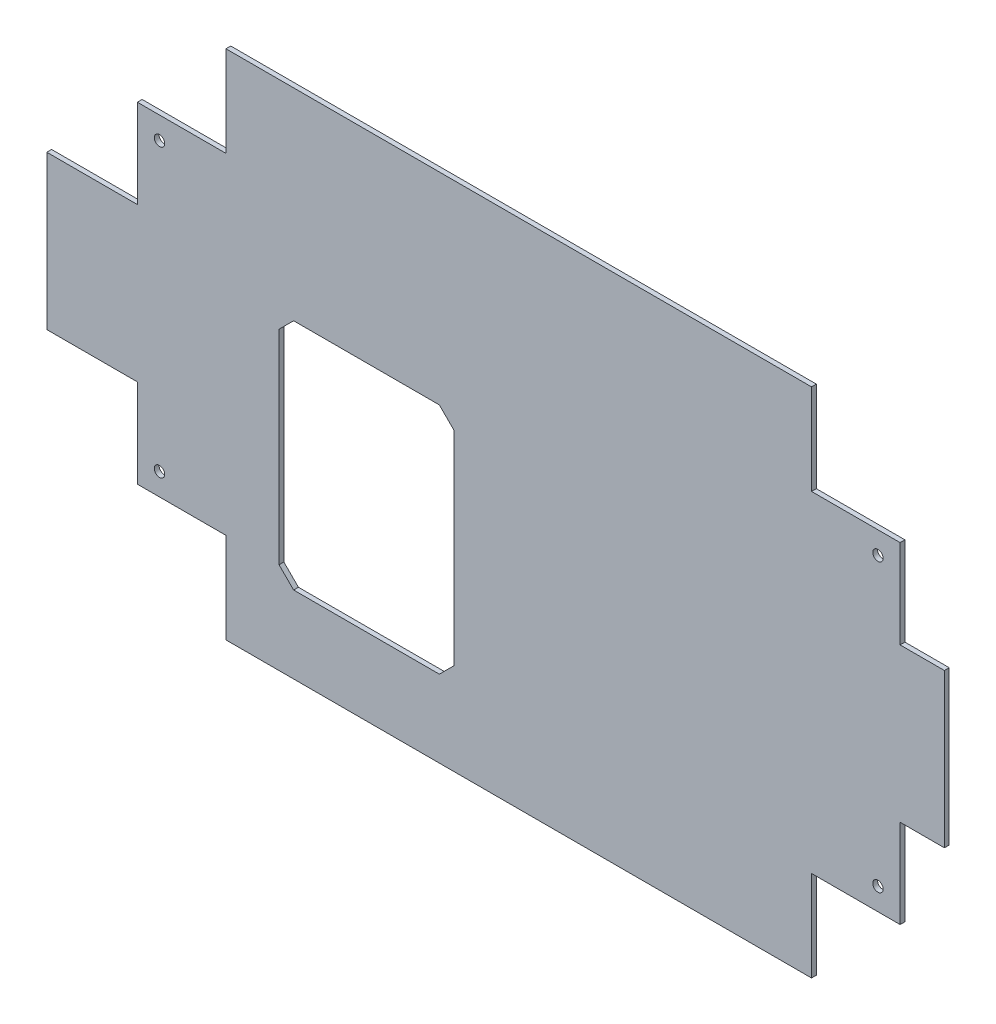
ISO-10303-21;
HEADER;
FILE_DESCRIPTION(('STEP AP214'),'2;1');
FILE_NAME('part.step','',(''),(''),'','','');
FILE_SCHEMA(('AUTOMOTIVE_DESIGN { 1 0 10303 214 1 1 1 1 }'));
ENDSEC;
DATA;
#1=APPLICATION_CONTEXT('core data for automotive mechanical design processes');
#2=APPLICATION_PROTOCOL_DEFINITION('international standard','automotive_design',2000,#1);
#3=PRODUCT_CONTEXT('',#1,'mechanical');
#4=PRODUCT('Part','Part','',(#3));
#5=PRODUCT_RELATED_PRODUCT_CATEGORY('part','',(#4));
#6=PRODUCT_DEFINITION_FORMATION('','',#4);
#7=PRODUCT_DEFINITION_CONTEXT('part definition',#1,'design');
#8=PRODUCT_DEFINITION('design','',#6,#7);
#9=PRODUCT_DEFINITION_SHAPE('','',#8);
#10=(LENGTH_UNIT() NAMED_UNIT(*) SI_UNIT(.MILLI.,.METRE.));
#11=(NAMED_UNIT(*) PLANE_ANGLE_UNIT() SI_UNIT($,.RADIAN.));
#12=(NAMED_UNIT(*) SI_UNIT($,.STERADIAN.) SOLID_ANGLE_UNIT());
#13=UNCERTAINTY_MEASURE_WITH_UNIT(LENGTH_MEASURE(1.E-05),#10,'distance_accuracy_value','');
#14=(GEOMETRIC_REPRESENTATION_CONTEXT(3) GLOBAL_UNCERTAINTY_ASSIGNED_CONTEXT((#13)) GLOBAL_UNIT_ASSIGNED_CONTEXT((#10,
#11,#12)) REPRESENTATION_CONTEXT('',''));
#15=CARTESIAN_POINT('',(0.,0.,0.));
#16=DIRECTION('',(0.,0.,1.));
#17=DIRECTION('',(1.,0.,0.));
#18=AXIS2_PLACEMENT_3D('',#15,#16,#17);
#19=CARTESIAN_POINT('',(-615.949999999996,52.7000000000002,3.3));
#20=DIRECTION('',(0.,-1.,0.));
#21=DIRECTION('',(1.,0.,0.));
#22=AXIS2_PLACEMENT_3D('',#19,#20,#21);
#23=PLANE('',#22);
#24=DIRECTION('',(-1.,0.,0.));
#25=VECTOR('',#24,1.);
#26=CARTESIAN_POINT('',(-615.949999999996,52.7000000000002,0.));
#27=LINE('',#26,#25);
#28=CARTESIAN_POINT('',(-553.799999999996,52.7000000000001,0.));
#29=VERTEX_POINT('',#28);
#30=CARTESIAN_POINT('',(-615.949999999996,52.7000000000002,0.));
#31=VERTEX_POINT('',#30);
#32=EDGE_CURVE('E289',#29,#31,#27,.T.);
#33=ORIENTED_EDGE('',*,*,#32,.T.);
#34=DIRECTION('',(0.,0.,-1.));
#35=VECTOR('',#34,1.);
#36=CARTESIAN_POINT('',(-615.949999999996,52.7000000000002,3.3));
#37=LINE('',#36,#35);
#38=CARTESIAN_POINT('',(-615.949999999996,52.7000000000002,3.3));
#39=VERTEX_POINT('',#38);
#40=EDGE_CURVE('E405',#39,#31,#37,.T.);
#41=ORIENTED_EDGE('',*,*,#40,.F.);
#42=DIRECTION('',(-1.,0.,0.));
#43=VECTOR('',#42,1.);
#44=CARTESIAN_POINT('',(-615.949999999996,52.7000000000002,3.3));
#45=LINE('',#44,#43);
#46=CARTESIAN_POINT('',(-553.799999999996,52.7000000000001,3.3));
#47=VERTEX_POINT('',#46);
#48=EDGE_CURVE('E291',#47,#39,#45,.T.);
#49=ORIENTED_EDGE('',*,*,#48,.F.);
#50=DIRECTION('',(0.,0.,-1.));
#51=VECTOR('',#50,1.);
#52=CARTESIAN_POINT('',(-553.799999999996,52.7000000000001,3.3));
#53=LINE('',#52,#51);
#54=EDGE_CURVE('E330',#47,#29,#53,.T.);
#55=ORIENTED_EDGE('',*,*,#54,.T.);
#56=EDGE_LOOP('',(#33,#41,#49,#55));
#57=FACE_BOUND('',#56,.T.);
#58=ADVANCED_FACE('F34',(#57),#23,.F.);
#59=CARTESIAN_POINT('',(-615.949999999996,52.7000000000002,3.3));
#60=DIRECTION('',(1.,0.,0.));
#61=DIRECTION('',(0.,0.,-1.));
#62=AXIS2_PLACEMENT_3D('',#59,#60,#61);
#63=PLANE('',#62);
#64=DIRECTION('',(0.,-1.,0.));
#65=VECTOR('',#64,1.);
#66=CARTESIAN_POINT('',(-615.949999999996,52.7000000000002,0.));
#67=LINE('',#66,#65);
#68=CARTESIAN_POINT('',(-615.949999999996,-52.7,0.));
#69=VERTEX_POINT('',#68);
#70=EDGE_CURVE('E333',#31,#69,#67,.T.);
#71=ORIENTED_EDGE('',*,*,#70,.T.);
#72=DIRECTION('',(0.,0.,-1.));
#73=VECTOR('',#72,1.);
#74=CARTESIAN_POINT('',(-615.949999999996,-52.7,3.3));
#75=LINE('',#74,#73);
#76=CARTESIAN_POINT('',(-615.949999999996,-52.7,3.3));
#77=VERTEX_POINT('',#76);
#78=EDGE_CURVE('E402',#77,#69,#75,.T.);
#79=ORIENTED_EDGE('',*,*,#78,.F.);
#80=DIRECTION('',(0.,-1.,0.));
#81=VECTOR('',#80,1.);
#82=CARTESIAN_POINT('',(-615.949999999996,52.7000000000002,3.3));
#83=LINE('',#82,#81);
#84=EDGE_CURVE('E294',#39,#77,#83,.T.);
#85=ORIENTED_EDGE('',*,*,#84,.F.);
#86=ORIENTED_EDGE('',*,*,#40,.T.);
#87=EDGE_LOOP('',(#71,#79,#85,#86));
#88=FACE_BOUND('',#87,.T.);
#89=ADVANCED_FACE('F489',(#88),#63,.F.);
#90=CARTESIAN_POINT('',(-615.949999999996,-52.7,3.3));
#91=DIRECTION('',(0.,1.,0.));
#92=DIRECTION('',(0.,0.,1.));
#93=AXIS2_PLACEMENT_3D('',#90,#91,#92);
#94=PLANE('',#93);
#95=DIRECTION('',(1.,0.,0.));
#96=VECTOR('',#95,1.);
#97=CARTESIAN_POINT('',(-615.949999999996,-52.7,0.));
#98=LINE('',#97,#96);
#99=CARTESIAN_POINT('',(-553.799999999996,-52.7,0.));
#100=VERTEX_POINT('',#99);
#101=EDGE_CURVE('E335',#69,#100,#98,.T.);
#102=ORIENTED_EDGE('',*,*,#101,.T.);
#103=DIRECTION('',(0.,0.,-1.));
#104=VECTOR('',#103,1.);
#105=CARTESIAN_POINT('',(-553.799999999996,-52.7,3.30000000000008));
#106=LINE('',#105,#104);
#107=CARTESIAN_POINT('',(-553.799999999996,-52.7,3.30000000000008));
#108=VERTEX_POINT('',#107);
#109=EDGE_CURVE('E399',#108,#100,#106,.T.);
#110=ORIENTED_EDGE('',*,*,#109,.F.);
#111=DIRECTION('',(1.,0.,0.));
#112=VECTOR('',#111,1.);
#113=CARTESIAN_POINT('',(-615.949999999996,-52.7,3.3));
#114=LINE('',#113,#112);
#115=EDGE_CURVE('E297',#77,#108,#114,.T.);
#116=ORIENTED_EDGE('',*,*,#115,.F.);
#117=ORIENTED_EDGE('',*,*,#78,.T.);
#118=EDGE_LOOP('',(#102,#110,#116,#117));
#119=FACE_BOUND('',#118,.T.);
#120=ADVANCED_FACE('F495',(#119),#94,.F.);
#121=CARTESIAN_POINT('',(-553.799999999996,-52.7,3.30000000000008));
#122=DIRECTION('',(1.,0.,0.));
#123=DIRECTION('',(0.,0.,-1.));
#124=AXIS2_PLACEMENT_3D('',#121,#122,#123);
#125=PLANE('',#124);
#126=DIRECTION('',(0.,-1.,0.));
#127=VECTOR('',#126,1.);
#128=CARTESIAN_POINT('',(-553.799999999996,-52.7,0.));
#129=LINE('',#128,#127);
#130=CARTESIAN_POINT('',(-553.799999999997,-113.5,0.));
#131=VERTEX_POINT('',#130);
#132=EDGE_CURVE('E337',#100,#131,#129,.T.);
#133=ORIENTED_EDGE('',*,*,#132,.T.);
#134=DIRECTION('',(0.,0.,-1.));
#135=VECTOR('',#134,1.);
#136=CARTESIAN_POINT('',(-553.799999999997,-113.5,3.30000000000008));
#137=LINE('',#136,#135);
#138=CARTESIAN_POINT('',(-553.799999999997,-113.5,3.30000000000008));
#139=VERTEX_POINT('',#138);
#140=EDGE_CURVE('E396',#139,#131,#137,.T.);
#141=ORIENTED_EDGE('',*,*,#140,.F.);
#142=DIRECTION('',(0.,-1.,0.));
#143=VECTOR('',#142,1.);
#144=CARTESIAN_POINT('',(-553.799999999996,-52.7,3.30000000000008));
#145=LINE('',#144,#143);
#146=EDGE_CURVE('E299',#108,#139,#145,.T.);
#147=ORIENTED_EDGE('',*,*,#146,.F.);
#148=ORIENTED_EDGE('',*,*,#109,.T.);
#149=EDGE_LOOP('',(#133,#141,#147,#148));
#150=FACE_BOUND('',#149,.T.);
#151=ADVANCED_FACE('F599',(#150),#125,.F.);
#152=CARTESIAN_POINT('',(-553.799999999997,-113.5,3.30000000000008));
#153=DIRECTION('',(0.,1.,0.));
#154=DIRECTION('',(-1.,0.,0.));
#155=AXIS2_PLACEMENT_3D('',#152,#153,#154);
#156=PLANE('',#155);
#157=DIRECTION('',(1.,0.,0.));
#158=VECTOR('',#157,1.);
#159=CARTESIAN_POINT('',(-553.799999999997,-113.5,0.));
#160=LINE('',#159,#158);
#161=CARTESIAN_POINT('',(-492.999999999999,-113.5,0.));
#162=VERTEX_POINT('',#161);
#163=EDGE_CURVE('E233',#131,#162,#160,.T.);
#164=ORIENTED_EDGE('',*,*,#163,.T.);
#165=DIRECTION('',(0.,0.,-1.));
#166=VECTOR('',#165,1.);
#167=CARTESIAN_POINT('',(-492.999999999999,-113.5,3.30000000000008));
#168=LINE('',#167,#166);
#169=CARTESIAN_POINT('',(-492.999999999999,-113.5,3.30000000000008));
#170=VERTEX_POINT('',#169);
#171=EDGE_CURVE('E228',#170,#162,#168,.T.);
#172=ORIENTED_EDGE('',*,*,#171,.F.);
#173=DIRECTION('',(1.,0.,0.));
#174=VECTOR('',#173,1.);
#175=CARTESIAN_POINT('',(-553.799999999997,-113.5,3.30000000000008));
#176=LINE('',#175,#174);
#177=EDGE_CURVE('E301',#139,#170,#176,.T.);
#178=ORIENTED_EDGE('',*,*,#177,.F.);
#179=ORIENTED_EDGE('',*,*,#140,.T.);
#180=EDGE_LOOP('',(#164,#172,#178,#179));
#181=FACE_BOUND('',#180,.T.);
#182=ADVANCED_FACE('F596',(#181),#156,.F.);
#183=CARTESIAN_POINT('',(-492.999999999999,-113.5,3.30000000000008));
#184=DIRECTION('',(1.,0.,0.));
#185=DIRECTION('',(0.,1.,0.));
#186=AXIS2_PLACEMENT_3D('',#183,#184,#185);
#187=PLANE('',#186);
#188=DIRECTION('',(0.,-1.,0.));
#189=VECTOR('',#188,1.);
#190=CARTESIAN_POINT('',(-492.999999999999,-113.5,0.));
#191=LINE('',#190,#189);
#192=CARTESIAN_POINT('',(-492.999999999999,-175.65,0.));
#193=VERTEX_POINT('',#192);
#194=EDGE_CURVE('E221',#162,#193,#191,.T.);
#195=ORIENTED_EDGE('',*,*,#194,.T.);
#196=DIRECTION('',(0.,0.,1.));
#197=VECTOR('',#196,1.);
#198=CARTESIAN_POINT('',(-492.999999999999,-175.65,0.));
#199=LINE('',#198,#197);
#200=CARTESIAN_POINT('',(-492.999999999999,-175.65,3.3));
#201=VERTEX_POINT('',#200);
#202=EDGE_CURVE('E225',#193,#201,#199,.T.);
#203=ORIENTED_EDGE('',*,*,#202,.T.);
#204=DIRECTION('',(0.,-1.,0.));
#205=VECTOR('',#204,1.);
#206=CARTESIAN_POINT('',(-492.999999999999,-113.5,3.30000000000008));
#207=LINE('',#206,#205);
#208=EDGE_CURVE('E303',#170,#201,#207,.T.);
#209=ORIENTED_EDGE('',*,*,#208,.F.);
#210=ORIENTED_EDGE('',*,*,#171,.T.);
#211=EDGE_LOOP('',(#195,#203,#209,#210));
#212=FACE_BOUND('',#211,.T.);
#213=ADVANCED_FACE('F223',(#212),#187,.F.);
#214=CARTESIAN_POINT('',(-91.2000000000022,-174.3,3.3));
#215=DIRECTION('',(-1.,0.,0.));
#216=DIRECTION('',(0.,0.,1.));
#217=AXIS2_PLACEMENT_3D('',#214,#215,#216);
#218=PLANE('',#217);
#219=DIRECTION('',(0.,1.,0.));
#220=VECTOR('',#219,1.);
#221=CARTESIAN_POINT('',(-91.2000000000022,-174.3,0.));
#222=LINE('',#221,#220);
#223=CARTESIAN_POINT('',(-91.2000000000022,-175.65,0.));
#224=VERTEX_POINT('',#223);
#225=CARTESIAN_POINT('',(-91.2000000000022,-113.5,0.));
#226=VERTEX_POINT('',#225);
#227=EDGE_CURVE('E232',#224,#226,#222,.T.);
#228=ORIENTED_EDGE('',*,*,#227,.T.);
#229=DIRECTION('',(0.,0.,-1.));
#230=VECTOR('',#229,1.);
#231=CARTESIAN_POINT('',(-91.2000000000022,-113.5,3.30000000000008));
#232=LINE('',#231,#230);
#233=CARTESIAN_POINT('',(-91.2000000000022,-113.5,3.30000000000008));
#234=VERTEX_POINT('',#233);
#235=EDGE_CURVE('E392',#234,#226,#232,.T.);
#236=ORIENTED_EDGE('',*,*,#235,.F.);
#237=DIRECTION('',(0.,1.,0.));
#238=VECTOR('',#237,1.);
#239=CARTESIAN_POINT('',(-91.2000000000022,-174.3,3.3));
#240=LINE('',#239,#238);
#241=CARTESIAN_POINT('',(-91.2000000000022,-175.65,3.3));
#242=VERTEX_POINT('',#241);
#243=EDGE_CURVE('E305',#242,#234,#240,.T.);
#244=ORIENTED_EDGE('',*,*,#243,.F.);
#245=DIRECTION('',(0.,0.,1.));
#246=VECTOR('',#245,1.);
#247=CARTESIAN_POINT('',(-91.2000000000022,-175.65,0.));
#248=LINE('',#247,#246);
#249=EDGE_CURVE('E242',#224,#242,#248,.T.);
#250=ORIENTED_EDGE('',*,*,#249,.F.);
#251=EDGE_LOOP('',(#228,#236,#244,#250));
#252=FACE_BOUND('',#251,.T.);
#253=ADVANCED_FACE('F589',(#252),#218,.F.);
#254=CARTESIAN_POINT('',(-91.2000000000022,-113.5,3.30000000000008));
#255=DIRECTION('',(0.,1.,0.));
#256=DIRECTION('',(-1.,0.,0.));
#257=AXIS2_PLACEMENT_3D('',#254,#255,#256);
#258=PLANE('',#257);
#259=DIRECTION('',(1.,0.,0.));
#260=VECTOR('',#259,1.);
#261=CARTESIAN_POINT('',(-91.2000000000022,-113.5,0.));
#262=LINE('',#261,#260);
#263=CARTESIAN_POINT('',(-30.4000000000042,-113.5,0.));
#264=VERTEX_POINT('',#263);
#265=EDGE_CURVE('E341',#226,#264,#262,.T.);
#266=ORIENTED_EDGE('',*,*,#265,.T.);
#267=DIRECTION('',(0.,0.,-1.));
#268=VECTOR('',#267,1.);
#269=CARTESIAN_POINT('',(-30.4000000000042,-113.5,3.30000000000008));
#270=LINE('',#269,#268);
#271=CARTESIAN_POINT('',(-30.4000000000042,-113.5,3.30000000000008));
#272=VERTEX_POINT('',#271);
#273=EDGE_CURVE('E389',#272,#264,#270,.T.);
#274=ORIENTED_EDGE('',*,*,#273,.F.);
#275=DIRECTION('',(1.,0.,0.));
#276=VECTOR('',#275,1.);
#277=CARTESIAN_POINT('',(-91.2000000000022,-113.5,3.30000000000008));
#278=LINE('',#277,#276);
#279=EDGE_CURVE('E307',#234,#272,#278,.T.);
#280=ORIENTED_EDGE('',*,*,#279,.F.);
#281=ORIENTED_EDGE('',*,*,#235,.T.);
#282=EDGE_LOOP('',(#266,#274,#280,#281));
#283=FACE_BOUND('',#282,.T.);
#284=ADVANCED_FACE('F585',(#283),#258,.F.);
#285=CARTESIAN_POINT('',(-30.4000000000042,-113.5,3.30000000000008));
#286=DIRECTION('',(-1.,0.,0.));
#287=DIRECTION('',(0.,0.,1.));
#288=AXIS2_PLACEMENT_3D('',#285,#286,#287);
#289=PLANE('',#288);
#290=DIRECTION('',(0.,1.,0.));
#291=VECTOR('',#290,1.);
#292=CARTESIAN_POINT('',(-30.4000000000042,-113.5,0.));
#293=LINE('',#292,#291);
#294=CARTESIAN_POINT('',(-30.4000000000042,-52.6999999999999,0.));
#295=VERTEX_POINT('',#294);
#296=EDGE_CURVE('E343',#264,#295,#293,.T.);
#297=ORIENTED_EDGE('',*,*,#296,.T.);
#298=DIRECTION('',(0.,0.,-1.));
#299=VECTOR('',#298,1.);
#300=CARTESIAN_POINT('',(-30.4000000000042,-52.6999999999999,3.3));
#301=LINE('',#300,#299);
#302=CARTESIAN_POINT('',(-30.4000000000042,-52.6999999999999,3.3));
#303=VERTEX_POINT('',#302);
#304=EDGE_CURVE('E386',#303,#295,#301,.T.);
#305=ORIENTED_EDGE('',*,*,#304,.F.);
#306=DIRECTION('',(0.,1.,0.));
#307=VECTOR('',#306,1.);
#308=CARTESIAN_POINT('',(-30.4000000000042,-113.5,3.30000000000008));
#309=LINE('',#308,#307);
#310=EDGE_CURVE('E309',#272,#303,#309,.T.);
#311=ORIENTED_EDGE('',*,*,#310,.F.);
#312=ORIENTED_EDGE('',*,*,#273,.T.);
#313=EDGE_LOOP('',(#297,#305,#311,#312));
#314=FACE_BOUND('',#313,.T.);
#315=ADVANCED_FACE('F581',(#314),#289,.F.);
#316=CARTESIAN_POINT('',(-30.4000000000042,-52.6999999999999,3.3));
#317=DIRECTION('',(0.,1.,0.));
#318=DIRECTION('',(-1.,0.,0.));
#319=AXIS2_PLACEMENT_3D('',#316,#317,#318);
#320=PLANE('',#319);
#321=DIRECTION('',(1.,0.,0.));
#322=VECTOR('',#321,1.);
#323=CARTESIAN_POINT('',(-30.4000000000042,-52.6999999999999,0.));
#324=LINE('',#323,#322);
#325=CARTESIAN_POINT('',(0.,-52.7,0.));
#326=VERTEX_POINT('',#325);
#327=EDGE_CURVE('E345',#295,#326,#324,.T.);
#328=ORIENTED_EDGE('',*,*,#327,.T.);
#329=DIRECTION('',(0.,0.,-1.));
#330=VECTOR('',#329,1.);
#331=CARTESIAN_POINT('',(0.,-52.7,3.3));
#332=LINE('',#331,#330);
#333=CARTESIAN_POINT('',(0.,-52.7,3.3));
#334=VERTEX_POINT('',#333);
#335=EDGE_CURVE('E383',#334,#326,#332,.T.);
#336=ORIENTED_EDGE('',*,*,#335,.F.);
#337=DIRECTION('',(1.,0.,0.));
#338=VECTOR('',#337,1.);
#339=CARTESIAN_POINT('',(-30.4000000000042,-52.6999999999999,3.3));
#340=LINE('',#339,#338);
#341=EDGE_CURVE('E311',#303,#334,#340,.T.);
#342=ORIENTED_EDGE('',*,*,#341,.F.);
#343=ORIENTED_EDGE('',*,*,#304,.T.);
#344=EDGE_LOOP('',(#328,#336,#342,#343));
#345=FACE_BOUND('',#344,.T.);
#346=ADVANCED_FACE('F577',(#345),#320,.F.);
#347=CARTESIAN_POINT('',(0.,-52.7,3.3));
#348=DIRECTION('',(-1.,0.,0.));
#349=DIRECTION('',(0.,-1.,0.));
#350=AXIS2_PLACEMENT_3D('',#347,#348,#349);
#351=PLANE('',#350);
#352=DIRECTION('',(0.,1.,0.));
#353=VECTOR('',#352,1.);
#354=CARTESIAN_POINT('',(0.,-52.7,0.));
#355=LINE('',#354,#353);
#356=CARTESIAN_POINT('',(0.,52.7,0.));
#357=VERTEX_POINT('',#356);
#358=EDGE_CURVE('E347',#326,#357,#355,.T.);
#359=ORIENTED_EDGE('',*,*,#358,.T.);
#360=DIRECTION('',(0.,0.,-1.));
#361=VECTOR('',#360,1.);
#362=CARTESIAN_POINT('',(0.,52.7,3.3));
#363=LINE('',#362,#361);
#364=CARTESIAN_POINT('',(0.,52.7,3.3));
#365=VERTEX_POINT('',#364);
#366=EDGE_CURVE('E380',#365,#357,#363,.T.);
#367=ORIENTED_EDGE('',*,*,#366,.F.);
#368=DIRECTION('',(0.,1.,0.));
#369=VECTOR('',#368,1.);
#370=CARTESIAN_POINT('',(0.,-52.7,3.3));
#371=LINE('',#370,#369);
#372=EDGE_CURVE('E313',#334,#365,#371,.T.);
#373=ORIENTED_EDGE('',*,*,#372,.F.);
#374=ORIENTED_EDGE('',*,*,#335,.T.);
#375=EDGE_LOOP('',(#359,#367,#373,#374));
#376=FACE_BOUND('',#375,.T.);
#377=ADVANCED_FACE('F573',(#376),#351,.F.);
#378=CARTESIAN_POINT('',(0.,52.7,3.3));
#379=DIRECTION('',(0.,-1.,0.));
#380=DIRECTION('',(0.,0.,-1.));
#381=AXIS2_PLACEMENT_3D('',#378,#379,#380);
#382=PLANE('',#381);
#383=DIRECTION('',(-1.,0.,0.));
#384=VECTOR('',#383,1.);
#385=CARTESIAN_POINT('',(0.,52.7,0.));
#386=LINE('',#385,#384);
#387=CARTESIAN_POINT('',(-30.4000000000042,52.7,0.));
#388=VERTEX_POINT('',#387);
#389=EDGE_CURVE('E349',#357,#388,#386,.T.);
#390=ORIENTED_EDGE('',*,*,#389,.T.);
#391=DIRECTION('',(0.,0.,-1.));
#392=VECTOR('',#391,1.);
#393=CARTESIAN_POINT('',(-30.4000000000042,52.7,3.3));
#394=LINE('',#393,#392);
#395=CARTESIAN_POINT('',(-30.4000000000042,52.7,3.3));
#396=VERTEX_POINT('',#395);
#397=EDGE_CURVE('E377',#396,#388,#394,.T.);
#398=ORIENTED_EDGE('',*,*,#397,.F.);
#399=DIRECTION('',(-1.,0.,0.));
#400=VECTOR('',#399,1.);
#401=CARTESIAN_POINT('',(0.,52.7,3.3));
#402=LINE('',#401,#400);
#403=EDGE_CURVE('E315',#365,#396,#402,.T.);
#404=ORIENTED_EDGE('',*,*,#403,.F.);
#405=ORIENTED_EDGE('',*,*,#366,.T.);
#406=EDGE_LOOP('',(#390,#398,#404,#405));
#407=FACE_BOUND('',#406,.T.);
#408=ADVANCED_FACE('F569',(#407),#382,.F.);
#409=CARTESIAN_POINT('',(-30.4000000000042,52.7,3.3));
#410=DIRECTION('',(-1.,0.,0.));
#411=DIRECTION('',(0.,-1.,0.));
#412=AXIS2_PLACEMENT_3D('',#409,#410,#411);
#413=PLANE('',#412);
#414=DIRECTION('',(0.,1.,0.));
#415=VECTOR('',#414,1.);
#416=CARTESIAN_POINT('',(-30.4000000000042,52.7,0.));
#417=LINE('',#416,#415);
#418=CARTESIAN_POINT('',(-30.4000000000042,113.5,0.));
#419=VERTEX_POINT('',#418);
#420=EDGE_CURVE('E351',#388,#419,#417,.T.);
#421=ORIENTED_EDGE('',*,*,#420,.T.);
#422=DIRECTION('',(0.,0.,-1.));
#423=VECTOR('',#422,1.);
#424=CARTESIAN_POINT('',(-30.4000000000042,113.5,3.3));
#425=LINE('',#424,#423);
#426=CARTESIAN_POINT('',(-30.4000000000042,113.5,3.3));
#427=VERTEX_POINT('',#426);
#428=EDGE_CURVE('E374',#427,#419,#425,.T.);
#429=ORIENTED_EDGE('',*,*,#428,.F.);
#430=DIRECTION('',(0.,1.,0.));
#431=VECTOR('',#430,1.);
#432=CARTESIAN_POINT('',(-30.4000000000042,52.7,3.3));
#433=LINE('',#432,#431);
#434=EDGE_CURVE('E317',#396,#427,#433,.T.);
#435=ORIENTED_EDGE('',*,*,#434,.F.);
#436=ORIENTED_EDGE('',*,*,#397,.T.);
#437=EDGE_LOOP('',(#421,#429,#435,#436));
#438=FACE_BOUND('',#437,.T.);
#439=ADVANCED_FACE('F565',(#438),#413,.F.);
#440=CARTESIAN_POINT('',(-30.4000000000042,113.5,3.3));
#441=DIRECTION('',(0.,-1.,0.));
#442=DIRECTION('',(1.,0.,0.));
#443=AXIS2_PLACEMENT_3D('',#440,#441,#442);
#444=PLANE('',#443);
#445=DIRECTION('',(-1.,0.,0.));
#446=VECTOR('',#445,1.);
#447=CARTESIAN_POINT('',(-30.4000000000042,113.5,0.));
#448=LINE('',#447,#446);
#449=CARTESIAN_POINT('',(-91.2000000000022,113.5,0.));
#450=VERTEX_POINT('',#449);
#451=EDGE_CURVE('E353',#419,#450,#448,.T.);
#452=ORIENTED_EDGE('',*,*,#451,.T.);
#453=DIRECTION('',(0.,0.,-1.));
#454=VECTOR('',#453,1.);
#455=CARTESIAN_POINT('',(-91.2000000000022,113.5,3.3));
#456=LINE('',#455,#454);
#457=CARTESIAN_POINT('',(-91.2000000000022,113.5,3.3));
#458=VERTEX_POINT('',#457);
#459=EDGE_CURVE('E371',#458,#450,#456,.T.);
#460=ORIENTED_EDGE('',*,*,#459,.F.);
#461=DIRECTION('',(-1.,0.,0.));
#462=VECTOR('',#461,1.);
#463=CARTESIAN_POINT('',(-30.4000000000042,113.5,3.3));
#464=LINE('',#463,#462);
#465=EDGE_CURVE('E319',#427,#458,#464,.T.);
#466=ORIENTED_EDGE('',*,*,#465,.F.);
#467=ORIENTED_EDGE('',*,*,#428,.T.);
#468=EDGE_LOOP('',(#452,#460,#466,#467));
#469=FACE_BOUND('',#468,.T.);
#470=ADVANCED_FACE('F561',(#469),#444,.F.);
#471=CARTESIAN_POINT('',(-91.2000000000022,113.5,3.3));
#472=DIRECTION('',(-1.,0.,0.));
#473=DIRECTION('',(0.,-1.,0.));
#474=AXIS2_PLACEMENT_3D('',#471,#472,#473);
#475=PLANE('',#474);
#476=DIRECTION('',(0.,1.,0.));
#477=VECTOR('',#476,1.);
#478=CARTESIAN_POINT('',(-91.2000000000022,113.5,0.));
#479=LINE('',#478,#477);
#480=CARTESIAN_POINT('',(-91.2000000000023,175.65,0.));
#481=VERTEX_POINT('',#480);
#482=EDGE_CURVE('E355',#450,#481,#479,.T.);
#483=ORIENTED_EDGE('',*,*,#482,.T.);
#484=DIRECTION('',(0.,0.,1.));
#485=VECTOR('',#484,1.);
#486=CARTESIAN_POINT('',(-91.2000000000022,175.65,0.));
#487=LINE('',#486,#485);
#488=CARTESIAN_POINT('',(-91.2000000000022,175.65,3.30000000000008));
#489=VERTEX_POINT('',#488);
#490=EDGE_CURVE('E286',#481,#489,#487,.T.);
#491=ORIENTED_EDGE('',*,*,#490,.T.);
#492=DIRECTION('',(0.,1.,0.));
#493=VECTOR('',#492,1.);
#494=CARTESIAN_POINT('',(-91.2000000000022,113.5,3.3));
#495=LINE('',#494,#493);
#496=EDGE_CURVE('E321',#458,#489,#495,.T.);
#497=ORIENTED_EDGE('',*,*,#496,.F.);
#498=ORIENTED_EDGE('',*,*,#459,.T.);
#499=EDGE_LOOP('',(#483,#491,#497,#498));
#500=FACE_BOUND('',#499,.T.);
#501=ADVANCED_FACE('F557',(#500),#475,.F.);
#502=CARTESIAN_POINT('',(-492.999999999999,113.5,3.3));
#503=DIRECTION('',(1.,0.,0.));
#504=DIRECTION('',(0.,0.,-1.));
#505=AXIS2_PLACEMENT_3D('',#502,#503,#504);
#506=PLANE('',#505);
#507=DIRECTION('',(0.,-1.,0.));
#508=VECTOR('',#507,1.);
#509=CARTESIAN_POINT('',(-492.999999999999,113.5,3.3));
#510=LINE('',#509,#508);
#511=CARTESIAN_POINT('',(-492.999999999999,175.65,3.30000000000008));
#512=VERTEX_POINT('',#511);
#513=CARTESIAN_POINT('',(-492.999999999999,113.5,3.3));
#514=VERTEX_POINT('',#513);
#515=EDGE_CURVE('E324',#512,#514,#510,.T.);
#516=ORIENTED_EDGE('',*,*,#515,.F.);
#517=DIRECTION('',(0.,0.,1.));
#518=VECTOR('',#517,1.);
#519=CARTESIAN_POINT('',(-492.999999999999,175.65,0.));
#520=LINE('',#519,#518);
#521=CARTESIAN_POINT('',(-492.999999999999,175.65,0.));
#522=VERTEX_POINT('',#521);
#523=EDGE_CURVE('E284',#522,#512,#520,.T.);
#524=ORIENTED_EDGE('',*,*,#523,.F.);
#525=DIRECTION('',(0.,-1.,0.));
#526=VECTOR('',#525,1.);
#527=CARTESIAN_POINT('',(-492.999999999999,113.5,0.));
#528=LINE('',#527,#526);
#529=CARTESIAN_POINT('',(-492.999999999999,113.5,0.));
#530=VERTEX_POINT('',#529);
#531=EDGE_CURVE('E358',#522,#530,#528,.T.);
#532=ORIENTED_EDGE('',*,*,#531,.T.);
#533=DIRECTION('',(0.,0.,-1.));
#534=VECTOR('',#533,1.);
#535=CARTESIAN_POINT('',(-492.999999999999,113.5,3.3));
#536=LINE('',#535,#534);
#537=EDGE_CURVE('E368',#514,#530,#536,.T.);
#538=ORIENTED_EDGE('',*,*,#537,.F.);
#539=EDGE_LOOP('',(#516,#524,#532,#538));
#540=FACE_BOUND('',#539,.T.);
#541=ADVANCED_FACE('F553',(#540),#506,.F.);
#542=CARTESIAN_POINT('',(-553.799999999996,113.5,3.3));
#543=DIRECTION('',(0.,-1.,0.));
#544=DIRECTION('',(1.,0.,0.));
#545=AXIS2_PLACEMENT_3D('',#542,#543,#544);
#546=PLANE('',#545);
#547=DIRECTION('',(-1.,0.,0.));
#548=VECTOR('',#547,1.);
#549=CARTESIAN_POINT('',(-553.799999999996,113.5,0.));
#550=LINE('',#549,#548);
#551=CARTESIAN_POINT('',(-553.799999999996,113.5,0.));
#552=VERTEX_POINT('',#551);
#553=EDGE_CURVE('E360',#530,#552,#550,.T.);
#554=ORIENTED_EDGE('',*,*,#553,.T.);
#555=DIRECTION('',(0.,0.,-1.));
#556=VECTOR('',#555,1.);
#557=CARTESIAN_POINT('',(-553.799999999996,113.5,3.3));
#558=LINE('',#557,#556);
#559=CARTESIAN_POINT('',(-553.799999999996,113.5,3.3));
#560=VERTEX_POINT('',#559);
#561=EDGE_CURVE('E365',#560,#552,#558,.T.);
#562=ORIENTED_EDGE('',*,*,#561,.F.);
#563=DIRECTION('',(-1.,0.,0.));
#564=VECTOR('',#563,1.);
#565=CARTESIAN_POINT('',(-553.799999999996,113.5,3.3));
#566=LINE('',#565,#564);
#567=EDGE_CURVE('E326',#514,#560,#566,.T.);
#568=ORIENTED_EDGE('',*,*,#567,.F.);
#569=ORIENTED_EDGE('',*,*,#537,.T.);
#570=EDGE_LOOP('',(#554,#562,#568,#569));
#571=FACE_BOUND('',#570,.T.);
#572=ADVANCED_FACE('F549',(#571),#546,.F.);
#573=CARTESIAN_POINT('',(-553.799999999996,52.7000000000001,3.3));
#574=DIRECTION('',(1.,0.,0.));
#575=DIRECTION('',(0.,0.,-1.));
#576=AXIS2_PLACEMENT_3D('',#573,#574,#575);
#577=PLANE('',#576);
#578=DIRECTION('',(0.,-1.,0.));
#579=VECTOR('',#578,1.);
#580=CARTESIAN_POINT('',(-553.799999999996,52.7000000000001,0.));
#581=LINE('',#580,#579);
#582=EDGE_CURVE('E295',#552,#29,#581,.T.);
#583=ORIENTED_EDGE('',*,*,#582,.T.);
#584=ORIENTED_EDGE('',*,*,#54,.F.);
#585=DIRECTION('',(0.,-1.,0.));
#586=VECTOR('',#585,1.);
#587=CARTESIAN_POINT('',(-553.799999999996,52.7000000000001,3.3));
#588=LINE('',#587,#586);
#589=EDGE_CURVE('E328',#560,#47,#588,.T.);
#590=ORIENTED_EDGE('',*,*,#589,.F.);
#591=ORIENTED_EDGE('',*,*,#561,.T.);
#592=EDGE_LOOP('',(#583,#584,#590,#591));
#593=FACE_BOUND('',#592,.T.);
#594=ADVANCED_FACE('F544',(#593),#577,.F.);
#595=CARTESIAN_POINT('',(0.,0.,3.3));
#596=DIRECTION('',(0.,0.,1.));
#597=DIRECTION('',(1.,0.,0.));
#598=AXIS2_PLACEMENT_3D('',#595,#596,#597);
#599=PLANE('',#598);
#600=DIRECTION('',(1.,0.,0.));
#601=VECTOR('',#600,1.);
#602=CARTESIAN_POINT('',(-456.566519886666,37.2316052691823,3.3));
#603=LINE('',#602,#601);
#604=CARTESIAN_POINT('',(-446.566519886666,37.2316052691823,3.3));
#605=VERTEX_POINT('',#604);
#606=CARTESIAN_POINT('',(-346.566519886666,37.2316052691823,3.29999999999994));
#607=VERTEX_POINT('',#606);
#608=EDGE_CURVE('E249',#605,#607,#603,.T.);
#609=ORIENTED_EDGE('',*,*,#608,.T.);
#610=DIRECTION('',(-0.707106781186544,0.707106781186552,0.));
#611=VECTOR('',#610,1.);
#612=CARTESIAN_POINT('',(-336.566519886666,27.2316052691822,3.29999999999994));
#613=LINE('',#612,#611);
#614=CARTESIAN_POINT('',(-336.566519886666,27.2316052691822,3.29999999999994));
#615=VERTEX_POINT('',#614);
#616=EDGE_CURVE('E11',#607,#615,#613,.F.);
#617=ORIENTED_EDGE('',*,*,#616,.T.);
#618=DIRECTION('',(0.,-1.,0.));
#619=VECTOR('',#618,1.);
#620=CARTESIAN_POINT('',(-336.566519886666,37.2316052691823,3.29999999999991));
#621=LINE('',#620,#619);
#622=CARTESIAN_POINT('',(-336.566519886666,-112.768394730818,3.3));
#623=VERTEX_POINT('',#622);
#624=EDGE_CURVE('E448',#615,#623,#621,.T.);
#625=ORIENTED_EDGE('',*,*,#624,.T.);
#626=DIRECTION('',(0.707106781186548,0.707106781186548,0.));
#627=VECTOR('',#626,1.);
#628=CARTESIAN_POINT('',(-346.566519886666,-122.768394730818,3.3));
#629=LINE('',#628,#627);
#630=CARTESIAN_POINT('',(-346.566519886666,-122.768394730818,3.3));
#631=VERTEX_POINT('',#630);
#632=EDGE_CURVE('E429',#623,#631,#629,.F.);
#633=ORIENTED_EDGE('',*,*,#632,.T.);
#634=DIRECTION('',(-1.,0.,0.));
#635=VECTOR('',#634,1.);
#636=CARTESIAN_POINT('',(-336.566519886666,-122.768394730818,3.3));
#637=LINE('',#636,#635);
#638=CARTESIAN_POINT('',(-446.566519886666,-122.768394730818,3.3));
#639=VERTEX_POINT('',#638);
#640=EDGE_CURVE('E459',#631,#639,#637,.T.);
#641=ORIENTED_EDGE('',*,*,#640,.T.);
#642=DIRECTION('',(0.707106781186544,-0.707106781186552,0.));
#643=VECTOR('',#642,1.);
#644=CARTESIAN_POINT('',(-456.566519886666,-112.768394730818,3.30000000000003));
#645=LINE('',#644,#643);
#646=CARTESIAN_POINT('',(-456.566519886666,-112.768394730818,3.30000000000003));
#647=VERTEX_POINT('',#646);
#648=EDGE_CURVE('E433',#639,#647,#645,.F.);
#649=ORIENTED_EDGE('',*,*,#648,.T.);
#650=DIRECTION('',(0.,1.,0.));
#651=VECTOR('',#650,1.);
#652=CARTESIAN_POINT('',(-456.566519886666,-122.768394730818,3.30000000000003));
#653=LINE('',#652,#651);
#654=CARTESIAN_POINT('',(-456.566519886666,27.2316052691822,3.3));
#655=VERTEX_POINT('',#654);
#656=EDGE_CURVE('E462',#647,#655,#653,.T.);
#657=ORIENTED_EDGE('',*,*,#656,.T.);
#658=DIRECTION('',(-0.707106781186548,-0.707106781186548,0.));
#659=VECTOR('',#658,1.);
#660=CARTESIAN_POINT('',(-446.566519886666,37.2316052691823,3.3));
#661=LINE('',#660,#659);
#662=EDGE_CURVE('E56',#655,#605,#661,.F.);
#663=ORIENTED_EDGE('',*,*,#662,.T.);
#664=EDGE_LOOP('',(#609,#617,#625,#633,#641,#649,#657,#663));
#665=FACE_BOUND('',#664,.T.);
#666=CARTESIAN_POINT('',(-45.6000000000042,98.3000000000002,3.3));
#667=DIRECTION('',(0.,0.,-1.));
#668=DIRECTION('',(-1.,0.,0.));
#669=AXIS2_PLACEMENT_3D('',#666,#667,#668);
#670=CIRCLE('',#669,3.57123999999999);
#671=CARTESIAN_POINT('',(-49.1712400000042,98.3000000000002,3.3));
#672=VERTEX_POINT('',#671);
#673=EDGE_CURVE('E259',#672,#672,#670,.T.);
#674=ORIENTED_EDGE('',*,*,#673,.T.);
#675=EDGE_LOOP('',(#674));
#676=FACE_BOUND('',#675,.T.);
#677=CARTESIAN_POINT('',(-45.6000000000085,-98.3000000000019,3.30000000000008));
#678=DIRECTION('',(0.,0.,-1.));
#679=DIRECTION('',(-1.,0.,0.));
#680=AXIS2_PLACEMENT_3D('',#677,#678,#679);
#681=CIRCLE('',#680,3.57123999999999);
#682=CARTESIAN_POINT('',(-49.1712400000085,-98.3000000000019,3.30000000000008));
#683=VERTEX_POINT('',#682);
#684=EDGE_CURVE('E265',#683,#683,#681,.T.);
#685=ORIENTED_EDGE('',*,*,#684,.T.);
#686=EDGE_LOOP('',(#685));
#687=FACE_BOUND('',#686,.T.);
#688=CARTESIAN_POINT('',(-538.600000000005,-98.3,3.30000000000008));
#689=DIRECTION('',(0.,0.,-1.));
#690=DIRECTION('',(-1.,0.,0.));
#691=AXIS2_PLACEMENT_3D('',#688,#689,#690);
#692=CIRCLE('',#691,3.57123999999998);
#693=CARTESIAN_POINT('',(-542.171240000005,-98.3,3.30000000000008));
#694=VERTEX_POINT('',#693);
#695=EDGE_CURVE('E271',#694,#694,#692,.T.);
#696=ORIENTED_EDGE('',*,*,#695,.T.);
#697=EDGE_LOOP('',(#696));
#698=FACE_BOUND('',#697,.T.);
#699=CARTESIAN_POINT('',(-538.600000000005,98.3000000000004,3.3));
#700=DIRECTION('',(0.,0.,-1.));
#701=DIRECTION('',(-1.,0.,0.));
#702=AXIS2_PLACEMENT_3D('',#699,#700,#701);
#703=CIRCLE('',#702,3.57123999999998);
#704=CARTESIAN_POINT('',(-542.171240000005,98.3000000000004,3.3));
#705=VERTEX_POINT('',#704);
#706=EDGE_CURVE('E277',#705,#705,#703,.T.);
#707=ORIENTED_EDGE('',*,*,#706,.T.);
#708=EDGE_LOOP('',(#707));
#709=FACE_BOUND('',#708,.T.);
#710=DIRECTION('',(1.,0.,0.));
#711=VECTOR('',#710,1.);
#712=CARTESIAN_POINT('',(-492.999999999999,175.65,3.30000000000008));
#713=LINE('',#712,#711);
#714=EDGE_CURVE('E280',#512,#489,#713,.T.);
#715=ORIENTED_EDGE('',*,*,#714,.F.);
#716=ORIENTED_EDGE('',*,*,#515,.T.);
#717=ORIENTED_EDGE('',*,*,#567,.T.);
#718=ORIENTED_EDGE('',*,*,#589,.T.);
#719=ORIENTED_EDGE('',*,*,#48,.T.);
#720=ORIENTED_EDGE('',*,*,#84,.T.);
#721=ORIENTED_EDGE('',*,*,#115,.T.);
#722=ORIENTED_EDGE('',*,*,#146,.T.);
#723=ORIENTED_EDGE('',*,*,#177,.T.);
#724=ORIENTED_EDGE('',*,*,#208,.T.);
#725=DIRECTION('',(1.,0.,0.));
#726=VECTOR('',#725,1.);
#727=CARTESIAN_POINT('',(-492.999999999999,-175.65,3.3));
#728=LINE('',#727,#726);
#729=EDGE_CURVE('E241',#201,#242,#728,.T.);
#730=ORIENTED_EDGE('',*,*,#729,.T.);
#731=ORIENTED_EDGE('',*,*,#243,.T.);
#732=ORIENTED_EDGE('',*,*,#279,.T.);
#733=ORIENTED_EDGE('',*,*,#310,.T.);
#734=ORIENTED_EDGE('',*,*,#341,.T.);
#735=ORIENTED_EDGE('',*,*,#372,.T.);
#736=ORIENTED_EDGE('',*,*,#403,.T.);
#737=ORIENTED_EDGE('',*,*,#434,.T.);
#738=ORIENTED_EDGE('',*,*,#465,.T.);
#739=ORIENTED_EDGE('',*,*,#496,.T.);
#740=EDGE_LOOP('',(#715,#716,#717,#718,#719,#720,#721,#722,#723,#724,#730,#731,#732,#733,#734,
#735,#736,#737,#738,#739));
#741=FACE_BOUND('',#740,.T.);
#742=ADVANCED_FACE('F453',(#665,#676,#687,#698,#709,#741),#599,.T.);
#743=CARTESIAN_POINT('',(0.,0.,0.));
#744=DIRECTION('',(0.,0.,1.));
#745=DIRECTION('',(1.,0.,0.));
#746=AXIS2_PLACEMENT_3D('',#743,#744,#745);
#747=PLANE('',#746);
#748=DIRECTION('',(-1.,0.,0.));
#749=VECTOR('',#748,1.);
#750=CARTESIAN_POINT('',(-336.566519886666,-122.768394730818,0.));
#751=LINE('',#750,#749);
#752=CARTESIAN_POINT('',(-346.566519886666,-122.768394730818,0.));
#753=VERTEX_POINT('',#752);
#754=CARTESIAN_POINT('',(-446.566519886666,-122.768394730818,0.));
#755=VERTEX_POINT('',#754);
#756=EDGE_CURVE('E468',#753,#755,#751,.T.);
#757=ORIENTED_EDGE('',*,*,#756,.F.);
#758=DIRECTION('',(-0.707106781186548,-0.707106781186548,0.));
#759=VECTOR('',#758,1.);
#760=CARTESIAN_POINT('',(-111.899062577924,111.899062577924,0.));
#761=LINE('',#760,#759);
#762=CARTESIAN_POINT('',(-336.566519886666,-112.768394730818,0.));
#763=VERTEX_POINT('',#762);
#764=EDGE_CURVE('E427',#753,#763,#761,.F.);
#765=ORIENTED_EDGE('',*,*,#764,.T.);
#766=DIRECTION('',(0.,-1.,0.));
#767=VECTOR('',#766,1.);
#768=CARTESIAN_POINT('',(-336.566519886666,37.2316052691823,0.));
#769=LINE('',#768,#767);
#770=CARTESIAN_POINT('',(-336.566519886666,27.2316052691822,0.));
#771=VERTEX_POINT('',#770);
#772=EDGE_CURVE('E443',#771,#763,#769,.T.);
#773=ORIENTED_EDGE('',*,*,#772,.F.);
#774=DIRECTION('',(0.707106781186544,-0.707106781186552,0.));
#775=VECTOR('',#774,1.);
#776=CARTESIAN_POINT('',(-154.667457308744,-154.667457308742,0.));
#777=LINE('',#776,#775);
#778=CARTESIAN_POINT('',(-346.566519886666,37.2316052691823,0.));
#779=VERTEX_POINT('',#778);
#780=EDGE_CURVE('E42',#771,#779,#777,.F.);
#781=ORIENTED_EDGE('',*,*,#780,.T.);
#782=DIRECTION('',(1.,0.,0.));
#783=VECTOR('',#782,1.);
#784=CARTESIAN_POINT('',(-456.566519886666,37.2316052691823,0.));
#785=LINE('',#784,#783);
#786=CARTESIAN_POINT('',(-446.566519886666,37.2316052691823,0.));
#787=VERTEX_POINT('',#786);
#788=EDGE_CURVE('E252',#787,#779,#785,.T.);
#789=ORIENTED_EDGE('',*,*,#788,.F.);
#790=DIRECTION('',(0.707106781186548,0.707106781186548,0.));
#791=VECTOR('',#790,1.);
#792=CARTESIAN_POINT('',(-241.899062577924,241.899062577924,0.));
#793=LINE('',#792,#791);
#794=CARTESIAN_POINT('',(-456.566519886666,27.2316052691822,0.));
#795=VERTEX_POINT('',#794);
#796=EDGE_CURVE('E435',#787,#795,#793,.F.);
#797=ORIENTED_EDGE('',*,*,#796,.T.);
#798=DIRECTION('',(0.,1.,0.));
#799=VECTOR('',#798,1.);
#800=CARTESIAN_POINT('',(-456.566519886666,-122.768394730818,0.));
#801=LINE('',#800,#799);
#802=CARTESIAN_POINT('',(-456.566519886666,-112.768394730818,0.));
#803=VERTEX_POINT('',#802);
#804=EDGE_CURVE('E449',#803,#795,#801,.T.);
#805=ORIENTED_EDGE('',*,*,#804,.F.);
#806=DIRECTION('',(-0.707106781186544,0.707106781186552,0.));
#807=VECTOR('',#806,1.);
#808=CARTESIAN_POINT('',(-284.667457308744,-284.667457308741,0.));
#809=LINE('',#808,#807);
#810=EDGE_CURVE('E431',#803,#755,#809,.F.);
#811=ORIENTED_EDGE('',*,*,#810,.T.);
#812=EDGE_LOOP('',(#757,#765,#773,#781,#789,#797,#805,#811));
#813=FACE_BOUND('',#812,.T.);
#814=CARTESIAN_POINT('',(-45.6000000000042,98.3000000000002,0.));
#815=DIRECTION('',(0.,0.,-1.));
#816=DIRECTION('',(-1.,0.,0.));
#817=AXIS2_PLACEMENT_3D('',#814,#815,#816);
#818=CIRCLE('',#817,3.57123999999999);
#819=CARTESIAN_POINT('',(-49.1712400000042,98.3000000000002,0.));
#820=VERTEX_POINT('',#819);
#821=EDGE_CURVE('E255',#820,#820,#818,.T.);
#822=ORIENTED_EDGE('',*,*,#821,.F.);
#823=EDGE_LOOP('',(#822));
#824=FACE_BOUND('',#823,.T.);
#825=CARTESIAN_POINT('',(-45.6000000000085,-98.3000000000019,0.));
#826=DIRECTION('',(0.,0.,-1.));
#827=DIRECTION('',(-1.,0.,0.));
#828=AXIS2_PLACEMENT_3D('',#825,#826,#827);
#829=CIRCLE('',#828,3.57123999999999);
#830=CARTESIAN_POINT('',(-49.1712400000085,-98.3000000000019,0.));
#831=VERTEX_POINT('',#830);
#832=EDGE_CURVE('E262',#831,#831,#829,.T.);
#833=ORIENTED_EDGE('',*,*,#832,.F.);
#834=EDGE_LOOP('',(#833));
#835=FACE_BOUND('',#834,.T.);
#836=CARTESIAN_POINT('',(-538.600000000005,-98.3,0.));
#837=DIRECTION('',(0.,0.,-1.));
#838=DIRECTION('',(-1.,0.,0.));
#839=AXIS2_PLACEMENT_3D('',#836,#837,#838);
#840=CIRCLE('',#839,3.57123999999998);
#841=CARTESIAN_POINT('',(-542.171240000005,-98.3,0.));
#842=VERTEX_POINT('',#841);
#843=EDGE_CURVE('E268',#842,#842,#840,.T.);
#844=ORIENTED_EDGE('',*,*,#843,.F.);
#845=EDGE_LOOP('',(#844));
#846=FACE_BOUND('',#845,.T.);
#847=CARTESIAN_POINT('',(-538.600000000005,98.3000000000004,0.));
#848=DIRECTION('',(0.,0.,-1.));
#849=DIRECTION('',(-1.,0.,0.));
#850=AXIS2_PLACEMENT_3D('',#847,#848,#849);
#851=CIRCLE('',#850,3.57123999999998);
#852=CARTESIAN_POINT('',(-542.171240000005,98.3000000000004,0.));
#853=VERTEX_POINT('',#852);
#854=EDGE_CURVE('E274',#853,#853,#851,.T.);
#855=ORIENTED_EDGE('',*,*,#854,.F.);
#856=EDGE_LOOP('',(#855));
#857=FACE_BOUND('',#856,.T.);
#858=ORIENTED_EDGE('',*,*,#531,.F.);
#859=DIRECTION('',(1.,0.,0.));
#860=VECTOR('',#859,1.);
#861=CARTESIAN_POINT('',(-492.999999999999,175.65,0.));
#862=LINE('',#861,#860);
#863=EDGE_CURVE('E281',#522,#481,#862,.T.);
#864=ORIENTED_EDGE('',*,*,#863,.T.);
#865=ORIENTED_EDGE('',*,*,#482,.F.);
#866=ORIENTED_EDGE('',*,*,#451,.F.);
#867=ORIENTED_EDGE('',*,*,#420,.F.);
#868=ORIENTED_EDGE('',*,*,#389,.F.);
#869=ORIENTED_EDGE('',*,*,#358,.F.);
#870=ORIENTED_EDGE('',*,*,#327,.F.);
#871=ORIENTED_EDGE('',*,*,#296,.F.);
#872=ORIENTED_EDGE('',*,*,#265,.F.);
#873=ORIENTED_EDGE('',*,*,#227,.F.);
#874=DIRECTION('',(1.,0.,0.));
#875=VECTOR('',#874,1.);
#876=CARTESIAN_POINT('',(-492.999999999999,-175.65,0.));
#877=LINE('',#876,#875);
#878=EDGE_CURVE('E239',#193,#224,#877,.T.);
#879=ORIENTED_EDGE('',*,*,#878,.F.);
#880=ORIENTED_EDGE('',*,*,#194,.F.);
#881=ORIENTED_EDGE('',*,*,#163,.F.);
#882=ORIENTED_EDGE('',*,*,#132,.F.);
#883=ORIENTED_EDGE('',*,*,#101,.F.);
#884=ORIENTED_EDGE('',*,*,#70,.F.);
#885=ORIENTED_EDGE('',*,*,#32,.F.);
#886=ORIENTED_EDGE('',*,*,#582,.F.);
#887=ORIENTED_EDGE('',*,*,#553,.F.);
#888=EDGE_LOOP('',(#858,#864,#865,#866,#867,#868,#869,#870,#871,#872,#873,#879,#880,#881,#882,
#883,#884,#885,#886,#887));
#889=FACE_BOUND('',#888,.T.);
#890=ADVANCED_FACE('F245',(#813,#824,#835,#846,#857,#889),#747,.F.);
#891=CARTESIAN_POINT('',(-492.999999999999,175.65,0.));
#892=DIRECTION('',(0.,-1.,0.));
#893=DIRECTION('',(0.,0.,-1.));
#894=AXIS2_PLACEMENT_3D('',#891,#892,#893);
#895=PLANE('',#894);
#896=ORIENTED_EDGE('',*,*,#714,.T.);
#897=ORIENTED_EDGE('',*,*,#490,.F.);
#898=ORIENTED_EDGE('',*,*,#863,.F.);
#899=ORIENTED_EDGE('',*,*,#523,.T.);
#900=EDGE_LOOP('',(#896,#897,#898,#899));
#901=FACE_BOUND('',#900,.T.);
#902=ADVANCED_FACE('F537',(#901),#895,.F.);
#903=CARTESIAN_POINT('',(-538.600000000005,98.3000000000004,0.));
#904=DIRECTION('',(0.,0.,-1.));
#905=DIRECTION('',(-1.,0.,0.));
#906=AXIS2_PLACEMENT_3D('',#903,#904,#905);
#907=CYLINDRICAL_SURFACE('',#906,3.57123999999998);
#908=ORIENTED_EDGE('',*,*,#706,.F.);
#909=EDGE_LOOP('',(#908));
#910=FACE_BOUND('',#909,.T.);
#911=ORIENTED_EDGE('',*,*,#854,.T.);
#912=EDGE_LOOP('',(#911));
#913=FACE_BOUND('',#912,.T.);
#914=ADVANCED_FACE('F533',(#910,#913),#907,.F.);
#915=CARTESIAN_POINT('',(-538.600000000005,-98.3,0.));
#916=DIRECTION('',(0.,0.,-1.));
#917=DIRECTION('',(-1.,0.,0.));
#918=AXIS2_PLACEMENT_3D('',#915,#916,#917);
#919=CYLINDRICAL_SURFACE('',#918,3.57123999999998);
#920=ORIENTED_EDGE('',*,*,#695,.F.);
#921=EDGE_LOOP('',(#920));
#922=FACE_BOUND('',#921,.T.);
#923=ORIENTED_EDGE('',*,*,#843,.T.);
#924=EDGE_LOOP('',(#923));
#925=FACE_BOUND('',#924,.T.);
#926=ADVANCED_FACE('F529',(#922,#925),#919,.F.);
#927=CARTESIAN_POINT('',(-45.6000000000085,-98.3000000000019,0.));
#928=DIRECTION('',(0.,0.,-1.));
#929=DIRECTION('',(-1.,0.,0.));
#930=AXIS2_PLACEMENT_3D('',#927,#928,#929);
#931=CYLINDRICAL_SURFACE('',#930,3.57123999999999);
#932=ORIENTED_EDGE('',*,*,#684,.F.);
#933=EDGE_LOOP('',(#932));
#934=FACE_BOUND('',#933,.T.);
#935=ORIENTED_EDGE('',*,*,#832,.T.);
#936=EDGE_LOOP('',(#935));
#937=FACE_BOUND('',#936,.T.);
#938=ADVANCED_FACE('F525',(#934,#937),#931,.F.);
#939=CARTESIAN_POINT('',(-45.6000000000042,98.3000000000002,0.));
#940=DIRECTION('',(0.,0.,-1.));
#941=DIRECTION('',(-1.,0.,0.));
#942=AXIS2_PLACEMENT_3D('',#939,#940,#941);
#943=CYLINDRICAL_SURFACE('',#942,3.57123999999999);
#944=ORIENTED_EDGE('',*,*,#673,.F.);
#945=EDGE_LOOP('',(#944));
#946=FACE_BOUND('',#945,.T.);
#947=ORIENTED_EDGE('',*,*,#821,.T.);
#948=EDGE_LOOP('',(#947));
#949=FACE_BOUND('',#948,.T.);
#950=ADVANCED_FACE('F522',(#946,#949),#943,.F.);
#951=CARTESIAN_POINT('',(-492.999999999999,-175.65,0.));
#952=DIRECTION('',(0.,-1.,0.));
#953=DIRECTION('',(0.,0.,-1.));
#954=AXIS2_PLACEMENT_3D('',#951,#952,#953);
#955=PLANE('',#954);
#956=ORIENTED_EDGE('',*,*,#729,.F.);
#957=ORIENTED_EDGE('',*,*,#202,.F.);
#958=ORIENTED_EDGE('',*,*,#878,.T.);
#959=ORIENTED_EDGE('',*,*,#249,.T.);
#960=EDGE_LOOP('',(#956,#957,#958,#959));
#961=FACE_BOUND('',#960,.T.);
#962=ADVANCED_FACE('F237',(#961),#955,.T.);
#963=CARTESIAN_POINT('',(-336.566519886666,37.2316052691823,3.29999999999991));
#964=DIRECTION('',(1.,0.,0.));
#965=DIRECTION('',(0.,0.,-1.));
#966=AXIS2_PLACEMENT_3D('',#963,#964,#965);
#967=PLANE('',#966);
#968=ORIENTED_EDGE('',*,*,#772,.T.);
#969=DIRECTION('',(0.,0.,1.));
#970=VECTOR('',#969,1.);
#971=CARTESIAN_POINT('',(-336.566519886666,-112.768394730818,3.3));
#972=LINE('',#971,#970);
#973=EDGE_CURVE('E416',#763,#623,#972,.T.);
#974=ORIENTED_EDGE('',*,*,#973,.T.);
#975=ORIENTED_EDGE('',*,*,#624,.F.);
#976=DIRECTION('',(0.,0.,-1.));
#977=VECTOR('',#976,1.);
#978=CARTESIAN_POINT('',(-336.566519886666,27.2316052691822,0.));
#979=LINE('',#978,#977);
#980=EDGE_CURVE('E413',#615,#771,#979,.T.);
#981=ORIENTED_EDGE('',*,*,#980,.T.);
#982=EDGE_LOOP('',(#968,#974,#975,#981));
#983=FACE_BOUND('',#982,.T.);
#984=ADVANCED_FACE('F457',(#983),#967,.F.);
#985=CARTESIAN_POINT('',(-456.566519886666,37.2316052691823,3.3));
#986=DIRECTION('',(0.,1.,0.));
#987=DIRECTION('',(0.,0.,1.));
#988=AXIS2_PLACEMENT_3D('',#985,#986,#987);
#989=PLANE('',#988);
#990=ORIENTED_EDGE('',*,*,#608,.F.);
#991=DIRECTION('',(0.,0.,-1.));
#992=VECTOR('',#991,1.);
#993=CARTESIAN_POINT('',(-446.566519886666,37.2316052691823,0.));
#994=LINE('',#993,#992);
#995=EDGE_CURVE('E424',#605,#787,#994,.T.);
#996=ORIENTED_EDGE('',*,*,#995,.T.);
#997=ORIENTED_EDGE('',*,*,#788,.T.);
#998=DIRECTION('',(0.,0.,1.));
#999=VECTOR('',#998,1.);
#1000=CARTESIAN_POINT('',(-346.566519886666,37.2316052691823,3.29999999999994));
#1001=LINE('',#1000,#999);
#1002=EDGE_CURVE('E49',#779,#607,#1001,.T.);
#1003=ORIENTED_EDGE('',*,*,#1002,.T.);
#1004=EDGE_LOOP('',(#990,#996,#997,#1003));
#1005=FACE_BOUND('',#1004,.T.);
#1006=ADVANCED_FACE('F446',(#1005),#989,.F.);
#1007=CARTESIAN_POINT('',(-456.566519886666,-122.768394730818,3.30000000000003));
#1008=DIRECTION('',(-1.,0.,0.));
#1009=DIRECTION('',(0.,0.,1.));
#1010=AXIS2_PLACEMENT_3D('',#1007,#1008,#1009);
#1011=PLANE('',#1010);
#1012=ORIENTED_EDGE('',*,*,#656,.F.);
#1013=DIRECTION('',(0.,0.,-1.));
#1014=VECTOR('',#1013,1.);
#1015=CARTESIAN_POINT('',(-456.566519886666,-112.768394730818,0.));
#1016=LINE('',#1015,#1014);
#1017=EDGE_CURVE('E420',#647,#803,#1016,.T.);
#1018=ORIENTED_EDGE('',*,*,#1017,.T.);
#1019=ORIENTED_EDGE('',*,*,#804,.T.);
#1020=DIRECTION('',(0.,0.,1.));
#1021=VECTOR('',#1020,1.);
#1022=CARTESIAN_POINT('',(-456.566519886666,27.2316052691822,3.3));
#1023=LINE('',#1022,#1021);
#1024=EDGE_CURVE('E418',#795,#655,#1023,.T.);
#1025=ORIENTED_EDGE('',*,*,#1024,.T.);
#1026=EDGE_LOOP('',(#1012,#1018,#1019,#1025));
#1027=FACE_BOUND('',#1026,.T.);
#1028=ADVANCED_FACE('F475',(#1027),#1011,.F.);
#1029=CARTESIAN_POINT('',(-336.566519886666,-122.768394730818,3.3));
#1030=DIRECTION('',(0.,-1.,0.));
#1031=DIRECTION('',(0.,0.,-1.));
#1032=AXIS2_PLACEMENT_3D('',#1029,#1030,#1031);
#1033=PLANE('',#1032);
#1034=ORIENTED_EDGE('',*,*,#640,.F.);
#1035=DIRECTION('',(0.,0.,-1.));
#1036=VECTOR('',#1035,1.);
#1037=CARTESIAN_POINT('',(-346.566519886666,-122.768394730818,0.));
#1038=LINE('',#1037,#1036);
#1039=EDGE_CURVE('E410',#631,#753,#1038,.T.);
#1040=ORIENTED_EDGE('',*,*,#1039,.T.);
#1041=ORIENTED_EDGE('',*,*,#756,.T.);
#1042=DIRECTION('',(0.,0.,1.));
#1043=VECTOR('',#1042,1.);
#1044=CARTESIAN_POINT('',(-446.566519886666,-122.768394730818,3.3));
#1045=LINE('',#1044,#1043);
#1046=EDGE_CURVE('E408',#755,#639,#1045,.T.);
#1047=ORIENTED_EDGE('',*,*,#1046,.T.);
#1048=EDGE_LOOP('',(#1034,#1040,#1041,#1047));
#1049=FACE_BOUND('',#1048,.T.);
#1050=ADVANCED_FACE('F501',(#1049),#1033,.F.);
#1051=CARTESIAN_POINT('',(-346.566519886666,-122.768394730818,3.3));
#1052=DIRECTION('',(-0.707106781186548,0.707106781186548,0.));
#1053=DIRECTION('',(0.,0.,1.));
#1054=AXIS2_PLACEMENT_3D('',#1051,#1052,#1053);
#1055=PLANE('',#1054);
#1056=ORIENTED_EDGE('',*,*,#632,.F.);
#1057=ORIENTED_EDGE('',*,*,#973,.F.);
#1058=ORIENTED_EDGE('',*,*,#764,.F.);
#1059=ORIENTED_EDGE('',*,*,#1039,.F.);
#1060=EDGE_LOOP('',(#1056,#1057,#1058,#1059));
#1061=FACE_BOUND('',#1060,.T.);
#1062=ADVANCED_FACE('F485',(#1061),#1055,.T.);
#1063=CARTESIAN_POINT('',(-456.566519886666,-112.768394730818,3.30000000000003));
#1064=DIRECTION('',(0.707106781186552,0.707106781186544,0.));
#1065=DIRECTION('',(0.,0.,1.));
#1066=AXIS2_PLACEMENT_3D('',#1063,#1064,#1065);
#1067=PLANE('',#1066);
#1068=ORIENTED_EDGE('',*,*,#648,.F.);
#1069=ORIENTED_EDGE('',*,*,#1046,.F.);
#1070=ORIENTED_EDGE('',*,*,#810,.F.);
#1071=ORIENTED_EDGE('',*,*,#1017,.F.);
#1072=EDGE_LOOP('',(#1068,#1069,#1070,#1071));
#1073=FACE_BOUND('',#1072,.T.);
#1074=ADVANCED_FACE('F480',(#1073),#1067,.T.);
#1075=CARTESIAN_POINT('',(-446.566519886666,37.2316052691823,3.3));
#1076=DIRECTION('',(0.707106781186548,-0.707106781186548,0.));
#1077=DIRECTION('',(0.,0.,1.));
#1078=AXIS2_PLACEMENT_3D('',#1075,#1076,#1077);
#1079=PLANE('',#1078);
#1080=ORIENTED_EDGE('',*,*,#662,.F.);
#1081=ORIENTED_EDGE('',*,*,#1024,.F.);
#1082=ORIENTED_EDGE('',*,*,#796,.F.);
#1083=ORIENTED_EDGE('',*,*,#995,.F.);
#1084=EDGE_LOOP('',(#1080,#1081,#1082,#1083));
#1085=FACE_BOUND('',#1084,.T.);
#1086=ADVANCED_FACE('F478',(#1085),#1079,.T.);
#1087=CARTESIAN_POINT('',(-336.566519886666,27.2316052691822,3.29999999999994));
#1088=DIRECTION('',(-0.707106781186552,-0.707106781186544,0.));
#1089=DIRECTION('',(0.,0.,1.));
#1090=AXIS2_PLACEMENT_3D('',#1087,#1088,#1089);
#1091=PLANE('',#1090);
#1092=ORIENTED_EDGE('',*,*,#616,.F.);
#1093=ORIENTED_EDGE('',*,*,#1002,.F.);
#1094=ORIENTED_EDGE('',*,*,#780,.F.);
#1095=ORIENTED_EDGE('',*,*,#980,.F.);
#1096=EDGE_LOOP('',(#1092,#1093,#1094,#1095));
#1097=FACE_BOUND('',#1096,.T.);
#1098=ADVANCED_FACE('F36',(#1097),#1091,.T.);
#1099=CLOSED_SHELL('',(#58,#89,#120,#151,#182,#213,#253,#284,#315,#346,#377,#408,#439,#470,#501,
#541,#572,#594,#742,#890,#902,#914,#926,#938,#950,#962,#984,#1006,#1028,#1050,#1062,#1074,#1086,#1098));
#1100=MANIFOLD_SOLID_BREP('B2',#1099);
#1101=ADVANCED_BREP_SHAPE_REPRESENTATION('',(#18,#1100),#14);
#1102=SHAPE_DEFINITION_REPRESENTATION(#9,#1101);
ENDSEC;
END-ISO-10303-21;
